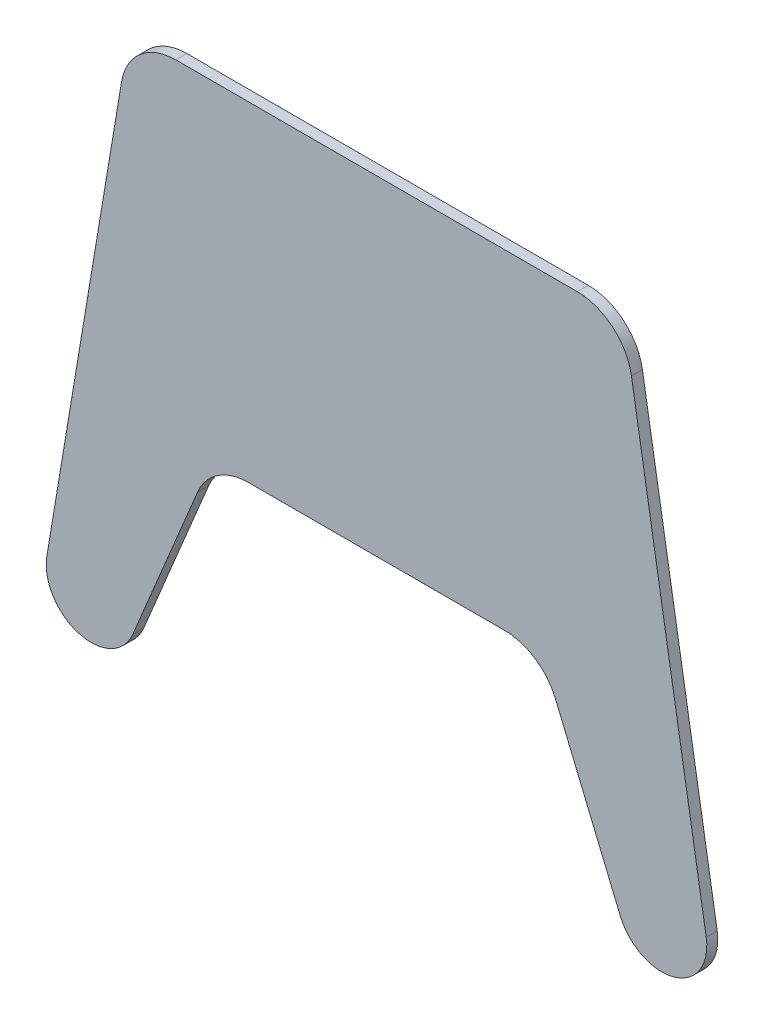
ISO-10303-21;
HEADER;
FILE_DESCRIPTION(('STEP AP214'),'2;1');
FILE_NAME('part.step','',(''),(''),'','','');
FILE_SCHEMA(('AUTOMOTIVE_DESIGN { 1 0 10303 214 1 1 1 1 }'));
ENDSEC;
DATA;
#1=APPLICATION_CONTEXT('core data for automotive mechanical design processes');
#2=APPLICATION_PROTOCOL_DEFINITION('international standard','automotive_design',2000,#1);
#3=PRODUCT_CONTEXT('',#1,'mechanical');
#4=PRODUCT('Part','Part','',(#3));
#5=PRODUCT_RELATED_PRODUCT_CATEGORY('part','',(#4));
#6=PRODUCT_DEFINITION_FORMATION('','',#4);
#7=PRODUCT_DEFINITION_CONTEXT('part definition',#1,'design');
#8=PRODUCT_DEFINITION('design','',#6,#7);
#9=PRODUCT_DEFINITION_SHAPE('','',#8);
#10=(LENGTH_UNIT() NAMED_UNIT(*) SI_UNIT(.MILLI.,.METRE.));
#11=(NAMED_UNIT(*) PLANE_ANGLE_UNIT() SI_UNIT($,.RADIAN.));
#12=(NAMED_UNIT(*) SI_UNIT($,.STERADIAN.) SOLID_ANGLE_UNIT());
#13=UNCERTAINTY_MEASURE_WITH_UNIT(LENGTH_MEASURE(1.E-05),#10,'distance_accuracy_value','');
#14=(GEOMETRIC_REPRESENTATION_CONTEXT(3) GLOBAL_UNCERTAINTY_ASSIGNED_CONTEXT((#13)) GLOBAL_UNIT_ASSIGNED_CONTEXT((#10,
#11,#12)) REPRESENTATION_CONTEXT('',''));
#15=CARTESIAN_POINT('',(0.,0.,0.));
#16=DIRECTION('',(0.,0.,1.));
#17=DIRECTION('',(1.,0.,0.));
#18=AXIS2_PLACEMENT_3D('',#15,#16,#17);
#19=CARTESIAN_POINT('',(-29.6333333333333,-50.8,2.54));
#20=DIRECTION('',(0.,0.,-1.));
#21=DIRECTION('',(-1.,0.,0.));
#22=AXIS2_PLACEMENT_3D('',#19,#20,#21);
#23=CYLINDRICAL_SURFACE('',#22,12.7);
#24=CARTESIAN_POINT('',(-29.6333333333333,-50.8,0.));
#25=DIRECTION('',(0.,0.,-1.));
#26=DIRECTION('',(-1.,0.,0.));
#27=AXIS2_PLACEMENT_3D('',#24,#25,#26);
#28=CIRCLE('',#27,12.7);
#29=CARTESIAN_POINT('',(-41.3564102564103,-45.9153846153847,0.));
#30=VERTEX_POINT('',#29);
#31=CARTESIAN_POINT('',(-29.6333333333333,-38.1,0.));
#32=VERTEX_POINT('',#31);
#33=EDGE_CURVE('E157',#30,#32,#28,.T.);
#34=ORIENTED_EDGE('',*,*,#33,.T.);
#35=DIRECTION('',(0.,0.,-1.));
#36=VECTOR('',#35,1.);
#37=CARTESIAN_POINT('',(-29.6333333333333,-38.1,2.54));
#38=LINE('',#37,#36);
#39=CARTESIAN_POINT('',(-29.6333333333333,-38.1,2.54));
#40=VERTEX_POINT('',#39);
#41=EDGE_CURVE('E41',#40,#32,#38,.T.);
#42=ORIENTED_EDGE('',*,*,#41,.F.);
#43=CARTESIAN_POINT('',(-29.6333333333333,-50.8,2.54));
#44=DIRECTION('',(0.,0.,-1.));
#45=DIRECTION('',(-1.,0.,0.));
#46=AXIS2_PLACEMENT_3D('',#43,#44,#45);
#47=CIRCLE('',#46,12.7);
#48=CARTESIAN_POINT('',(-41.3564102564103,-45.9153846153847,2.54));
#49=VERTEX_POINT('',#48);
#50=EDGE_CURVE('E105',#49,#40,#47,.T.);
#51=ORIENTED_EDGE('',*,*,#50,.F.);
#52=DIRECTION('',(0.,0.,-1.));
#53=VECTOR('',#52,1.);
#54=CARTESIAN_POINT('',(-41.3564102564103,-45.9153846153847,2.54));
#55=LINE('',#54,#53);
#56=EDGE_CURVE('E11',#49,#30,#55,.T.);
#57=ORIENTED_EDGE('',*,*,#56,.T.);
#58=EDGE_LOOP('',(#34,#42,#51,#57));
#59=FACE_BOUND('',#58,.T.);
#60=ADVANCED_FACE('F33',(#59),#23,.F.);
#61=CARTESIAN_POINT('',(-29.6333333333333,-38.1,2.54));
#62=DIRECTION('',(0.,1.,0.));
#63=DIRECTION('',(-1.,0.,0.));
#64=AXIS2_PLACEMENT_3D('',#61,#62,#63);
#65=PLANE('',#64);
#66=DIRECTION('',(1.,0.,0.));
#67=VECTOR('',#66,1.);
#68=CARTESIAN_POINT('',(-29.6333333333333,-38.1,0.));
#69=LINE('',#68,#67);
#70=CARTESIAN_POINT('',(29.6333333333333,-38.1,0.));
#71=VERTEX_POINT('',#70);
#72=EDGE_CURVE('E159',#32,#71,#69,.T.);
#73=ORIENTED_EDGE('',*,*,#72,.T.);
#74=DIRECTION('',(0.,0.,-1.));
#75=VECTOR('',#74,1.);
#76=CARTESIAN_POINT('',(29.6333333333333,-38.1,2.54));
#77=LINE('',#76,#75);
#78=CARTESIAN_POINT('',(29.6333333333333,-38.1,2.54));
#79=VERTEX_POINT('',#78);
#80=EDGE_CURVE('E197',#79,#71,#77,.T.);
#81=ORIENTED_EDGE('',*,*,#80,.F.);
#82=DIRECTION('',(1.,0.,0.));
#83=VECTOR('',#82,1.);
#84=CARTESIAN_POINT('',(-29.6333333333333,-38.1,2.54));
#85=LINE('',#84,#83);
#86=EDGE_CURVE('E205',#40,#79,#85,.T.);
#87=ORIENTED_EDGE('',*,*,#86,.F.);
#88=ORIENTED_EDGE('',*,*,#41,.T.);
#89=EDGE_LOOP('',(#73,#81,#87,#88));
#90=FACE_BOUND('',#89,.T.);
#91=ADVANCED_FACE('F203',(#90),#65,.F.);
#92=CARTESIAN_POINT('',(29.6333333333333,-50.8,2.54));
#93=DIRECTION('',(0.,0.,-1.));
#94=DIRECTION('',(-1.,0.,0.));
#95=AXIS2_PLACEMENT_3D('',#92,#93,#94);
#96=CYLINDRICAL_SURFACE('',#95,12.7);
#97=CARTESIAN_POINT('',(29.6333333333333,-50.8,0.));
#98=DIRECTION('',(0.,0.,-1.));
#99=DIRECTION('',(1.,0.,0.));
#100=AXIS2_PLACEMENT_3D('',#97,#98,#99);
#101=CIRCLE('',#100,12.7);
#102=CARTESIAN_POINT('',(41.3564102564103,-45.9153846153847,0.));
#103=VERTEX_POINT('',#102);
#104=EDGE_CURVE('E161',#71,#103,#101,.T.);
#105=ORIENTED_EDGE('',*,*,#104,.T.);
#106=DIRECTION('',(0.,0.,-1.));
#107=VECTOR('',#106,1.);
#108=CARTESIAN_POINT('',(41.3564102564103,-45.9153846153847,2.54));
#109=LINE('',#108,#107);
#110=CARTESIAN_POINT('',(41.3564102564103,-45.9153846153847,2.54));
#111=VERTEX_POINT('',#110);
#112=EDGE_CURVE('E194',#111,#103,#109,.T.);
#113=ORIENTED_EDGE('',*,*,#112,.F.);
#114=CARTESIAN_POINT('',(29.6333333333333,-50.8,2.54));
#115=DIRECTION('',(0.,0.,-1.));
#116=DIRECTION('',(1.,0.,0.));
#117=AXIS2_PLACEMENT_3D('',#114,#115,#116);
#118=CIRCLE('',#117,12.7);
#119=EDGE_CURVE('E223',#79,#111,#118,.T.);
#120=ORIENTED_EDGE('',*,*,#119,.F.);
#121=ORIENTED_EDGE('',*,*,#80,.T.);
#122=EDGE_LOOP('',(#105,#113,#120,#121));
#123=FACE_BOUND('',#122,.T.);
#124=ADVANCED_FACE('F214',(#123),#96,.F.);
#125=CARTESIAN_POINT('',(56.3527186574672,-81.9065247779213,2.54));
#126=DIRECTION('',(0.923076923076923,0.384615384615384,0.));
#127=DIRECTION('',(-0.384615384615384,0.923076923076924,0.));
#128=AXIS2_PLACEMENT_3D('',#125,#126,#127);
#129=PLANE('',#128);
#130=DIRECTION('',(0.384615384615384,-0.923076923076923,0.));
#131=VECTOR('',#130,1.);
#132=CARTESIAN_POINT('',(56.3527186574672,-81.9065247779213,0.));
#133=LINE('',#132,#131);
#134=CARTESIAN_POINT('',(56.3527186574672,-81.9065247779213,0.));
#135=VERTEX_POINT('',#134);
#136=EDGE_CURVE('E164',#103,#135,#133,.T.);
#137=ORIENTED_EDGE('',*,*,#136,.T.);
#138=DIRECTION('',(0.,0.,-1.));
#139=VECTOR('',#138,1.);
#140=CARTESIAN_POINT('',(56.3527186574672,-81.9065247779213,2.54));
#141=LINE('',#140,#139);
#142=CARTESIAN_POINT('',(56.3527186574672,-81.9065247779213,2.54));
#143=VERTEX_POINT('',#142);
#144=EDGE_CURVE('E191',#143,#135,#141,.T.);
#145=ORIENTED_EDGE('',*,*,#144,.F.);
#146=DIRECTION('',(0.384615384615385,-0.923076923076923,0.));
#147=VECTOR('',#146,1.);
#148=CARTESIAN_POINT('',(53.975,-76.2,2.54));
#149=LINE('',#148,#147);
#150=EDGE_CURVE('E220',#111,#143,#149,.T.);
#151=ORIENTED_EDGE('',*,*,#150,.F.);
#152=ORIENTED_EDGE('',*,*,#112,.T.);
#153=EDGE_LOOP('',(#137,#145,#151,#152));
#154=FACE_BOUND('',#153,.T.);
#155=ADVANCED_FACE('F218',(#154),#129,.F.);
#156=CARTESIAN_POINT('',(65.9472968741304,-77.9087838543116,2.54));
#157=DIRECTION('',(0.,0.,-1.));
#158=DIRECTION('',(-1.,0.,0.));
#159=AXIS2_PLACEMENT_3D('',#156,#157,#158);
#160=CYLINDRICAL_SURFACE('',#159,10.3941264013851);
#161=CARTESIAN_POINT('',(65.9472968741304,-77.9087838543116,0.));
#162=DIRECTION('',(0.,0.,1.));
#163=DIRECTION('',(-1.,0.,0.));
#164=AXIS2_PLACEMENT_3D('',#161,#162,#163);
#165=CIRCLE('',#164,10.3941264013851);
#166=CARTESIAN_POINT('',(76.2,-76.2,0.));
#167=VERTEX_POINT('',#166);
#168=EDGE_CURVE('E166',#135,#167,#165,.T.);
#169=ORIENTED_EDGE('',*,*,#168,.T.);
#170=DIRECTION('',(0.,0.,-1.));
#171=VECTOR('',#170,1.);
#172=CARTESIAN_POINT('',(76.2,-76.2,2.54));
#173=LINE('',#172,#171);
#174=CARTESIAN_POINT('',(76.2,-76.2,2.54));
#175=VERTEX_POINT('',#174);
#176=EDGE_CURVE('E188',#175,#167,#173,.T.);
#177=ORIENTED_EDGE('',*,*,#176,.F.);
#178=CARTESIAN_POINT('',(65.9472968741304,-77.9087838543116,2.54));
#179=DIRECTION('',(0.,0.,1.));
#180=DIRECTION('',(-1.,0.,0.));
#181=AXIS2_PLACEMENT_3D('',#178,#179,#180);
#182=CIRCLE('',#181,10.3941264013851);
#183=EDGE_CURVE('E222',#143,#175,#182,.T.);
#184=ORIENTED_EDGE('',*,*,#183,.F.);
#185=ORIENTED_EDGE('',*,*,#144,.T.);
#186=EDGE_LOOP('',(#169,#177,#184,#185));
#187=FACE_BOUND('',#186,.T.);
#188=ADVANCED_FACE('F265',(#187),#160,.T.);
#189=CARTESIAN_POINT('',(58.9186888102037,27.487867138778,2.54));
#190=DIRECTION('',(-0.986393923832144,-0.164398987305357,0.));
#191=DIRECTION('',(0.164398987305357,-0.986393923832144,0.));
#192=AXIS2_PLACEMENT_3D('',#189,#190,#191);
#193=PLANE('',#192);
#194=DIRECTION('',(-0.164398987305357,0.986393923832144,0.));
#195=VECTOR('',#194,1.);
#196=CARTESIAN_POINT('',(58.9186888102037,27.487867138778,0.));
#197=LINE('',#196,#195);
#198=CARTESIAN_POINT('',(58.9186888102037,27.487867138778,0.));
#199=VERTEX_POINT('',#198);
#200=EDGE_CURVE('E168',#167,#199,#197,.T.);
#201=ORIENTED_EDGE('',*,*,#200,.T.);
#202=DIRECTION('',(0.,0.,-1.));
#203=VECTOR('',#202,1.);
#204=CARTESIAN_POINT('',(58.9186888102037,27.487867138778,2.54));
#205=LINE('',#204,#203);
#206=CARTESIAN_POINT('',(58.9186888102037,27.487867138778,2.54));
#207=VERTEX_POINT('',#206);
#208=EDGE_CURVE('E185',#207,#199,#205,.T.);
#209=ORIENTED_EDGE('',*,*,#208,.F.);
#210=DIRECTION('',(-0.164398987305357,0.986393923832144,0.));
#211=VECTOR('',#210,1.);
#212=CARTESIAN_POINT('',(58.9186888102037,27.487867138778,2.54));
#213=LINE('',#212,#211);
#214=EDGE_CURVE('E225',#175,#207,#213,.T.);
#215=ORIENTED_EDGE('',*,*,#214,.F.);
#216=ORIENTED_EDGE('',*,*,#176,.T.);
#217=EDGE_LOOP('',(#201,#209,#215,#216));
#218=FACE_BOUND('',#217,.T.);
#219=ADVANCED_FACE('F268',(#218),#193,.F.);
#220=CARTESIAN_POINT('',(46.3914859775354,25.4,2.54));
#221=DIRECTION('',(0.,0.,-1.));
#222=DIRECTION('',(-1.,0.,0.));
#223=AXIS2_PLACEMENT_3D('',#220,#221,#222);
#224=CYLINDRICAL_SURFACE('',#223,12.7);
#225=CARTESIAN_POINT('',(46.3914859775354,25.4,0.));
#226=DIRECTION('',(0.,0.,1.));
#227=DIRECTION('',(-1.,0.,0.));
#228=AXIS2_PLACEMENT_3D('',#225,#226,#227);
#229=CIRCLE('',#228,12.7);
#230=CARTESIAN_POINT('',(46.3914859775354,38.1,0.));
#231=VERTEX_POINT('',#230);
#232=EDGE_CURVE('E170',#199,#231,#229,.T.);
#233=ORIENTED_EDGE('',*,*,#232,.T.);
#234=DIRECTION('',(0.,0.,-1.));
#235=VECTOR('',#234,1.);
#236=CARTESIAN_POINT('',(46.3914859775354,38.1,2.54));
#237=LINE('',#236,#235);
#238=CARTESIAN_POINT('',(46.3914859775354,38.1,2.54));
#239=VERTEX_POINT('',#238);
#240=EDGE_CURVE('E182',#239,#231,#237,.T.);
#241=ORIENTED_EDGE('',*,*,#240,.F.);
#242=CARTESIAN_POINT('',(46.3914859775354,25.4,2.54));
#243=DIRECTION('',(0.,0.,1.));
#244=DIRECTION('',(-1.,0.,0.));
#245=AXIS2_PLACEMENT_3D('',#242,#243,#244);
#246=CIRCLE('',#245,12.7);
#247=EDGE_CURVE('E231',#207,#239,#246,.T.);
#248=ORIENTED_EDGE('',*,*,#247,.F.);
#249=ORIENTED_EDGE('',*,*,#208,.T.);
#250=EDGE_LOOP('',(#233,#241,#248,#249));
#251=FACE_BOUND('',#250,.T.);
#252=ADVANCED_FACE('F237',(#251),#224,.T.);
#253=CARTESIAN_POINT('',(-46.3914859775354,38.1,2.54));
#254=DIRECTION('',(0.,-1.,0.));
#255=DIRECTION('',(1.,0.,0.));
#256=AXIS2_PLACEMENT_3D('',#253,#254,#255);
#257=PLANE('',#256);
#258=DIRECTION('',(-1.,0.,0.));
#259=VECTOR('',#258,1.);
#260=CARTESIAN_POINT('',(-46.3914859775354,38.1,0.));
#261=LINE('',#260,#259);
#262=CARTESIAN_POINT('',(-46.3914859775354,38.1,0.));
#263=VERTEX_POINT('',#262);
#264=EDGE_CURVE('E172',#231,#263,#261,.T.);
#265=ORIENTED_EDGE('',*,*,#264,.T.);
#266=DIRECTION('',(0.,0.,-1.));
#267=VECTOR('',#266,1.);
#268=CARTESIAN_POINT('',(-46.3914859775354,38.1,2.54));
#269=LINE('',#268,#267);
#270=CARTESIAN_POINT('',(-46.3914859775354,38.1,2.54));
#271=VERTEX_POINT('',#270);
#272=EDGE_CURVE('E146',#271,#263,#269,.T.);
#273=ORIENTED_EDGE('',*,*,#272,.F.);
#274=DIRECTION('',(-1.,0.,0.));
#275=VECTOR('',#274,1.);
#276=CARTESIAN_POINT('',(-46.3914859775354,38.1,2.54));
#277=LINE('',#276,#275);
#278=EDGE_CURVE('E137',#239,#271,#277,.T.);
#279=ORIENTED_EDGE('',*,*,#278,.F.);
#280=ORIENTED_EDGE('',*,*,#240,.T.);
#281=EDGE_LOOP('',(#265,#273,#279,#280));
#282=FACE_BOUND('',#281,.T.);
#283=ADVANCED_FACE('F241',(#282),#257,.F.);
#284=CARTESIAN_POINT('',(-46.3914859775354,25.4,2.54));
#285=DIRECTION('',(0.,0.,-1.));
#286=DIRECTION('',(-1.,0.,0.));
#287=AXIS2_PLACEMENT_3D('',#284,#285,#286);
#288=CYLINDRICAL_SURFACE('',#287,12.7);
#289=CARTESIAN_POINT('',(-46.3914859775354,25.4,0.));
#290=DIRECTION('',(0.,0.,1.));
#291=DIRECTION('',(-1.,0.,0.));
#292=AXIS2_PLACEMENT_3D('',#289,#290,#291);
#293=CIRCLE('',#292,12.7);
#294=CARTESIAN_POINT('',(-58.9186888102037,27.4878671387779,0.));
#295=VERTEX_POINT('',#294);
#296=EDGE_CURVE('E145',#263,#295,#293,.T.);
#297=ORIENTED_EDGE('',*,*,#296,.T.);
#298=DIRECTION('',(0.,0.,-1.));
#299=VECTOR('',#298,1.);
#300=CARTESIAN_POINT('',(-58.9186888102037,27.4878671387779,2.54));
#301=LINE('',#300,#299);
#302=CARTESIAN_POINT('',(-58.9186888102037,27.4878671387779,2.54));
#303=VERTEX_POINT('',#302);
#304=EDGE_CURVE('E142',#303,#295,#301,.T.);
#305=ORIENTED_EDGE('',*,*,#304,.F.);
#306=CARTESIAN_POINT('',(-46.3914859775354,25.4,2.54));
#307=DIRECTION('',(0.,0.,1.));
#308=DIRECTION('',(-1.,0.,0.));
#309=AXIS2_PLACEMENT_3D('',#306,#307,#308);
#310=CIRCLE('',#309,12.7);
#311=EDGE_CURVE('E131',#271,#303,#310,.T.);
#312=ORIENTED_EDGE('',*,*,#311,.F.);
#313=ORIENTED_EDGE('',*,*,#272,.T.);
#314=EDGE_LOOP('',(#297,#305,#312,#313));
#315=FACE_BOUND('',#314,.T.);
#316=ADVANCED_FACE('F143',(#315),#288,.T.);
#317=CARTESIAN_POINT('',(-58.9186888102037,27.4878671387779,2.54));
#318=DIRECTION('',(0.986393923832144,-0.164398987305357,0.));
#319=DIRECTION('',(0.164398987305357,0.986393923832144,0.));
#320=AXIS2_PLACEMENT_3D('',#317,#318,#319);
#321=PLANE('',#320);
#322=DIRECTION('',(-0.164398987305357,-0.986393923832144,0.));
#323=VECTOR('',#322,1.);
#324=CARTESIAN_POINT('',(-58.9186888102037,27.4878671387779,0.));
#325=LINE('',#324,#323);
#326=CARTESIAN_POINT('',(-76.2,-76.2,0.));
#327=VERTEX_POINT('',#326);
#328=EDGE_CURVE('E91',#295,#327,#325,.T.);
#329=ORIENTED_EDGE('',*,*,#328,.T.);
#330=DIRECTION('',(0.,0.,-1.));
#331=VECTOR('',#330,1.);
#332=CARTESIAN_POINT('',(-76.2,-76.2,2.54));
#333=LINE('',#332,#331);
#334=CARTESIAN_POINT('',(-76.2,-76.2,2.54));
#335=VERTEX_POINT('',#334);
#336=EDGE_CURVE('E147',#335,#327,#333,.T.);
#337=ORIENTED_EDGE('',*,*,#336,.F.);
#338=DIRECTION('',(-0.164398987305357,-0.986393923832144,0.));
#339=VECTOR('',#338,1.);
#340=CARTESIAN_POINT('',(-58.9186888102037,27.4878671387779,2.54));
#341=LINE('',#340,#339);
#342=EDGE_CURVE('E135',#303,#335,#341,.T.);
#343=ORIENTED_EDGE('',*,*,#342,.F.);
#344=ORIENTED_EDGE('',*,*,#304,.T.);
#345=EDGE_LOOP('',(#329,#337,#343,#344));
#346=FACE_BOUND('',#345,.T.);
#347=ADVANCED_FACE('F149',(#346),#321,.F.);
#348=CARTESIAN_POINT('',(-65.9472968741304,-77.9087838543116,2.54));
#349=DIRECTION('',(0.,0.,-1.));
#350=DIRECTION('',(-1.,0.,0.));
#351=AXIS2_PLACEMENT_3D('',#348,#349,#350);
#352=CYLINDRICAL_SURFACE('',#351,10.3941264013851);
#353=CARTESIAN_POINT('',(-65.9472968741304,-77.9087838543116,0.));
#354=DIRECTION('',(0.,0.,1.));
#355=DIRECTION('',(1.,0.,0.));
#356=AXIS2_PLACEMENT_3D('',#353,#354,#355);
#357=CIRCLE('',#356,10.3941264013851);
#358=CARTESIAN_POINT('',(-56.3527186574672,-81.9065247779213,0.));
#359=VERTEX_POINT('',#358);
#360=EDGE_CURVE('E98',#327,#359,#357,.T.);
#361=ORIENTED_EDGE('',*,*,#360,.T.);
#362=DIRECTION('',(0.,0.,-1.));
#363=VECTOR('',#362,1.);
#364=CARTESIAN_POINT('',(-56.3527186574672,-81.9065247779213,2.54));
#365=LINE('',#364,#363);
#366=CARTESIAN_POINT('',(-56.3527186574672,-81.9065247779213,2.54));
#367=VERTEX_POINT('',#366);
#368=EDGE_CURVE('E153',#367,#359,#365,.T.);
#369=ORIENTED_EDGE('',*,*,#368,.F.);
#370=CARTESIAN_POINT('',(-65.9472968741304,-77.9087838543116,2.54));
#371=DIRECTION('',(0.,0.,1.));
#372=DIRECTION('',(1.,0.,0.));
#373=AXIS2_PLACEMENT_3D('',#370,#371,#372);
#374=CIRCLE('',#373,10.3941264013851);
#375=EDGE_CURVE('E151',#335,#367,#374,.T.);
#376=ORIENTED_EDGE('',*,*,#375,.F.);
#377=ORIENTED_EDGE('',*,*,#336,.T.);
#378=EDGE_LOOP('',(#361,#369,#376,#377));
#379=FACE_BOUND('',#378,.T.);
#380=ADVANCED_FACE('F243',(#379),#352,.T.);
#381=CARTESIAN_POINT('',(-56.3527186574672,-81.9065247779213,2.54));
#382=DIRECTION('',(-0.923076923076921,0.384615384615391,0.));
#383=DIRECTION('',(-0.384615384615391,-0.92307692307692,0.));
#384=AXIS2_PLACEMENT_3D('',#381,#382,#383);
#385=PLANE('',#384);
#386=DIRECTION('',(0.384615384615391,0.92307692307692,0.));
#387=VECTOR('',#386,1.);
#388=CARTESIAN_POINT('',(-56.3527186574672,-81.9065247779213,0.));
#389=LINE('',#388,#387);
#390=EDGE_CURVE('E177',#359,#30,#389,.T.);
#391=ORIENTED_EDGE('',*,*,#390,.T.);
#392=ORIENTED_EDGE('',*,*,#56,.F.);
#393=DIRECTION('',(0.384615384615384,0.923076923076923,0.));
#394=VECTOR('',#393,1.);
#395=CARTESIAN_POINT('',(-53.975,-76.2,2.54));
#396=LINE('',#395,#394);
#397=EDGE_CURVE('E49',#367,#49,#396,.T.);
#398=ORIENTED_EDGE('',*,*,#397,.F.);
#399=ORIENTED_EDGE('',*,*,#368,.T.);
#400=EDGE_LOOP('',(#391,#392,#398,#399));
#401=FACE_BOUND('',#400,.T.);
#402=ADVANCED_FACE('F242',(#401),#385,.F.);
#403=CARTESIAN_POINT('',(-29.6333333333333,-50.8,2.54));
#404=DIRECTION('',(0.,0.,-1.));
#405=DIRECTION('',(-1.,0.,0.));
#406=AXIS2_PLACEMENT_3D('',#403,#404,#405);
#407=PLANE('',#406);
#408=ORIENTED_EDGE('',*,*,#397,.T.);
#409=ORIENTED_EDGE('',*,*,#50,.T.);
#410=ORIENTED_EDGE('',*,*,#86,.T.);
#411=ORIENTED_EDGE('',*,*,#119,.T.);
#412=ORIENTED_EDGE('',*,*,#150,.T.);
#413=ORIENTED_EDGE('',*,*,#183,.T.);
#414=ORIENTED_EDGE('',*,*,#214,.T.);
#415=ORIENTED_EDGE('',*,*,#247,.T.);
#416=ORIENTED_EDGE('',*,*,#278,.T.);
#417=ORIENTED_EDGE('',*,*,#311,.T.);
#418=ORIENTED_EDGE('',*,*,#342,.T.);
#419=ORIENTED_EDGE('',*,*,#375,.T.);
#420=EDGE_LOOP('',(#408,#409,#410,#411,#412,#413,#414,#415,#416,#417,#418,#419));
#421=FACE_BOUND('',#420,.T.);
#422=ADVANCED_FACE('F133',(#421),#407,.F.);
#423=CARTESIAN_POINT('',(-29.6333333333333,-50.8,0.));
#424=DIRECTION('',(0.,0.,-1.));
#425=DIRECTION('',(-1.,0.,0.));
#426=AXIS2_PLACEMENT_3D('',#423,#424,#425);
#427=PLANE('',#426);
#428=ORIENTED_EDGE('',*,*,#33,.F.);
#429=ORIENTED_EDGE('',*,*,#390,.F.);
#430=ORIENTED_EDGE('',*,*,#360,.F.);
#431=ORIENTED_EDGE('',*,*,#328,.F.);
#432=ORIENTED_EDGE('',*,*,#296,.F.);
#433=ORIENTED_EDGE('',*,*,#264,.F.);
#434=ORIENTED_EDGE('',*,*,#232,.F.);
#435=ORIENTED_EDGE('',*,*,#200,.F.);
#436=ORIENTED_EDGE('',*,*,#168,.F.);
#437=ORIENTED_EDGE('',*,*,#136,.F.);
#438=ORIENTED_EDGE('',*,*,#104,.F.);
#439=ORIENTED_EDGE('',*,*,#72,.F.);
#440=EDGE_LOOP('',(#428,#429,#430,#431,#432,#433,#434,#435,#436,#437,#438,#439));
#441=FACE_BOUND('',#440,.T.);
#442=ADVANCED_FACE('F209',(#441),#427,.T.);
#443=CLOSED_SHELL('',(#60,#91,#124,#155,#188,#219,#252,#283,#316,#347,#380,#402,#422,#442));
#444=MANIFOLD_SOLID_BREP('B2',#443);
#445=ADVANCED_BREP_SHAPE_REPRESENTATION('',(#18,#444),#14);
#446=SHAPE_DEFINITION_REPRESENTATION(#9,#445);
ENDSEC;
END-ISO-10303-21;
